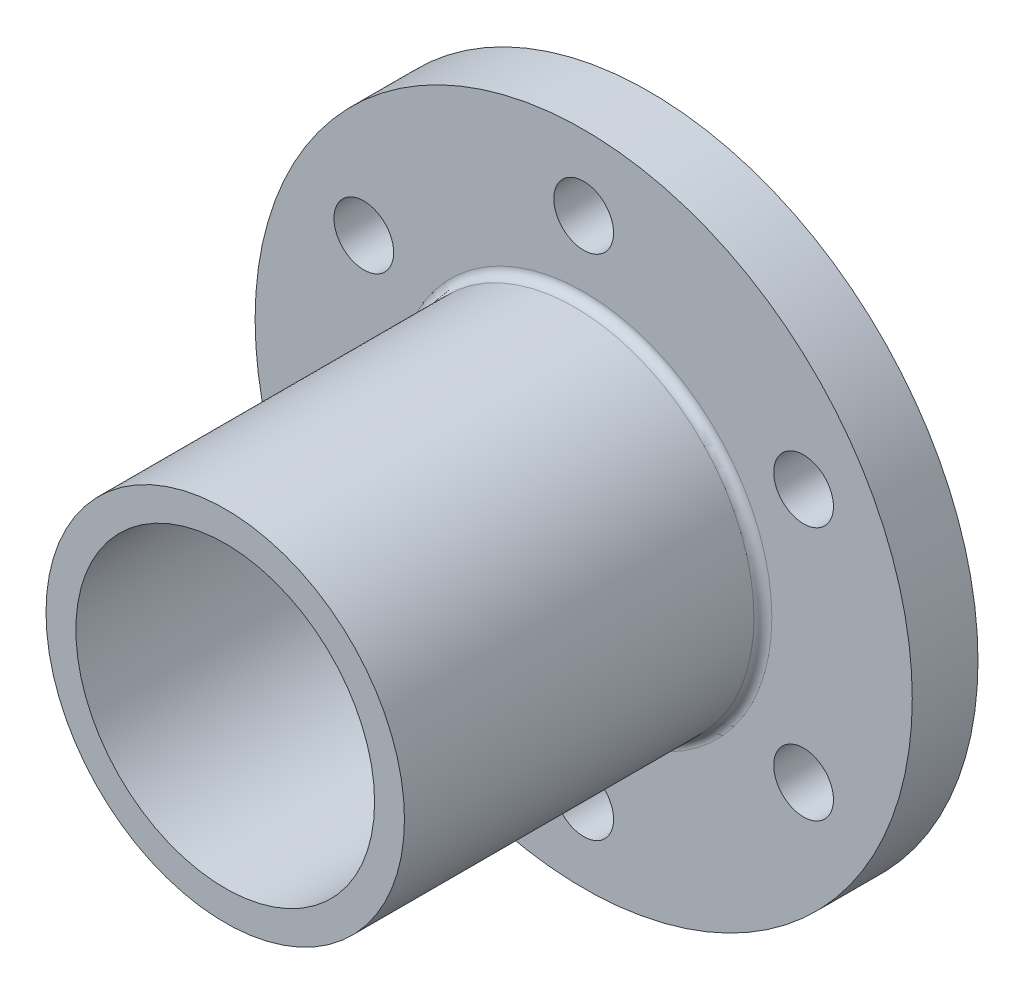
ISO-10303-21;
HEADER;
FILE_DESCRIPTION(('STEP AP214'),'2;1');
FILE_NAME('part.step','',(''),(''),'','','');
FILE_SCHEMA(('AUTOMOTIVE_DESIGN { 1 0 10303 214 1 1 1 1 }'));
ENDSEC;
DATA;
#1=APPLICATION_CONTEXT('core data for automotive mechanical design processes');
#2=APPLICATION_PROTOCOL_DEFINITION('international standard','automotive_design',2000,#1);
#3=PRODUCT_CONTEXT('',#1,'mechanical');
#4=PRODUCT('Part','Part','',(#3));
#5=PRODUCT_RELATED_PRODUCT_CATEGORY('part','',(#4));
#6=PRODUCT_DEFINITION_FORMATION('','',#4);
#7=PRODUCT_DEFINITION_CONTEXT('part definition',#1,'design');
#8=PRODUCT_DEFINITION('design','',#6,#7);
#9=PRODUCT_DEFINITION_SHAPE('','',#8);
#10=(LENGTH_UNIT() NAMED_UNIT(*) SI_UNIT(.MILLI.,.METRE.));
#11=(NAMED_UNIT(*) PLANE_ANGLE_UNIT() SI_UNIT($,.RADIAN.));
#12=(NAMED_UNIT(*) SI_UNIT($,.STERADIAN.) SOLID_ANGLE_UNIT());
#13=UNCERTAINTY_MEASURE_WITH_UNIT(LENGTH_MEASURE(1.E-05),#10,'distance_accuracy_value','');
#14=(GEOMETRIC_REPRESENTATION_CONTEXT(3) GLOBAL_UNCERTAINTY_ASSIGNED_CONTEXT((#13)) GLOBAL_UNIT_ASSIGNED_CONTEXT((#10,
#11,#12)) REPRESENTATION_CONTEXT('',''));
#15=CARTESIAN_POINT('',(0.,0.,0.));
#16=DIRECTION('',(0.,0.,1.));
#17=DIRECTION('',(1.,0.,0.));
#18=AXIS2_PLACEMENT_3D('',#15,#16,#17);
#19=CARTESIAN_POINT('',(0.,0.,22.));
#20=DIRECTION('',(0.,0.,-1.));
#21=DIRECTION('',(-1.,0.,0.));
#22=AXIS2_PLACEMENT_3D('',#19,#20,#21);
#23=CYLINDRICAL_SURFACE('',#22,110.);
#24=CARTESIAN_POINT('',(0.,0.,22.));
#25=DIRECTION('',(0.,0.,1.));
#26=DIRECTION('',(1.,0.,0.));
#27=AXIS2_PLACEMENT_3D('',#24,#25,#26);
#28=CIRCLE('',#27,110.);
#29=CARTESIAN_POINT('',(110.,0.,22.));
#30=VERTEX_POINT('',#29);
#31=EDGE_CURVE('E42',#30,#30,#28,.T.);
#32=ORIENTED_EDGE('',*,*,#31,.F.);
#33=EDGE_LOOP('',(#32));
#34=FACE_BOUND('',#33,.T.);
#35=CARTESIAN_POINT('',(0.,0.,0.));
#36=DIRECTION('',(0.,0.,1.));
#37=DIRECTION('',(1.,0.,0.));
#38=AXIS2_PLACEMENT_3D('',#35,#36,#37);
#39=CIRCLE('',#38,110.);
#40=CARTESIAN_POINT('',(110.,0.,0.));
#41=VERTEX_POINT('',#40);
#42=EDGE_CURVE('E46',#41,#41,#39,.T.);
#43=ORIENTED_EDGE('',*,*,#42,.T.);
#44=EDGE_LOOP('',(#43));
#45=FACE_BOUND('',#44,.T.);
#46=ADVANCED_FACE('F31',(#34,#45),#23,.T.);
#47=CARTESIAN_POINT('',(0.,0.,22.));
#48=DIRECTION('',(0.,0.,1.));
#49=DIRECTION('',(1.,0.,0.));
#50=AXIS2_PLACEMENT_3D('',#47,#48,#49);
#51=PLANE('',#50);
#52=CARTESIAN_POINT('',(0.,0.,22.));
#53=DIRECTION('',(0.,0.,1.));
#54=DIRECTION('',(1.,0.,0.));
#55=AXIS2_PLACEMENT_3D('',#52,#53,#54);
#56=CIRCLE('',#55,63.);
#57=CARTESIAN_POINT('',(63.,0.,22.));
#58=VERTEX_POINT('',#57);
#59=EDGE_CURVE('E10',#58,#58,#56,.F.);
#60=ORIENTED_EDGE('',*,*,#59,.T.);
#61=EDGE_LOOP('',(#60));
#62=FACE_BOUND('',#61,.T.);
#63=CARTESIAN_POINT('',(73.6121593216792,42.5,22.));
#64=DIRECTION('',(0.,0.,1.));
#65=DIRECTION('',(1.,0.,0.));
#66=AXIS2_PLACEMENT_3D('',#63,#64,#65);
#67=CIRCLE('',#66,9.99999999999878);
#68=CARTESIAN_POINT('',(83.6121593216779,42.5,22.));
#69=VERTEX_POINT('',#68);
#70=EDGE_CURVE('E91',#69,#69,#67,.T.);
#71=ORIENTED_EDGE('',*,*,#70,.F.);
#72=EDGE_LOOP('',(#71));
#73=FACE_BOUND('',#72,.T.);
#74=CARTESIAN_POINT('',(73.6121593216773,-42.5,22.));
#75=DIRECTION('',(0.,0.,1.));
#76=DIRECTION('',(1.,0.,0.));
#77=AXIS2_PLACEMENT_3D('',#74,#75,#76);
#78=CIRCLE('',#77,10.0000000000004);
#79=CARTESIAN_POINT('',(83.6121593216777,-42.5,22.));
#80=VERTEX_POINT('',#79);
#81=EDGE_CURVE('E85',#80,#80,#78,.T.);
#82=ORIENTED_EDGE('',*,*,#81,.F.);
#83=EDGE_LOOP('',(#82));
#84=FACE_BOUND('',#83,.T.);
#85=CARTESIAN_POINT('',(0.,-85.,22.));
#86=DIRECTION('',(0.,0.,1.));
#87=DIRECTION('',(1.,0.,0.));
#88=AXIS2_PLACEMENT_3D('',#85,#86,#87);
#89=CIRCLE('',#88,10.0000000000006);
#90=CARTESIAN_POINT('',(10.0000000000006,-85.,22.));
#91=VERTEX_POINT('',#90);
#92=EDGE_CURVE('E79',#91,#91,#89,.T.);
#93=ORIENTED_EDGE('',*,*,#92,.F.);
#94=EDGE_LOOP('',(#93));
#95=FACE_BOUND('',#94,.T.);
#96=CARTESIAN_POINT('',(-73.6121593216773,-42.5,22.));
#97=DIRECTION('',(0.,0.,1.));
#98=DIRECTION('',(1.,0.,0.));
#99=AXIS2_PLACEMENT_3D('',#96,#97,#98);
#100=CIRCLE('',#99,10.0000000000008);
#101=CARTESIAN_POINT('',(-63.6121593216765,-42.5,22.));
#102=VERTEX_POINT('',#101);
#103=EDGE_CURVE('E73',#102,#102,#100,.T.);
#104=ORIENTED_EDGE('',*,*,#103,.F.);
#105=EDGE_LOOP('',(#104));
#106=FACE_BOUND('',#105,.T.);
#107=CARTESIAN_POINT('',(-73.6121593216782,42.4999999999984,22.));
#108=DIRECTION('',(0.,0.,1.));
#109=DIRECTION('',(1.,0.,0.));
#110=AXIS2_PLACEMENT_3D('',#107,#108,#109);
#111=CIRCLE('',#110,10.0000000000027);
#112=CARTESIAN_POINT('',(-63.6121593216755,42.4999999999984,22.));
#113=VERTEX_POINT('',#112);
#114=EDGE_CURVE('E67',#113,#113,#111,.T.);
#115=ORIENTED_EDGE('',*,*,#114,.F.);
#116=EDGE_LOOP('',(#115));
#117=FACE_BOUND('',#116,.T.);
#118=CARTESIAN_POINT('',(0.,85.,22.));
#119=DIRECTION('',(0.,0.,1.));
#120=DIRECTION('',(1.,0.,0.));
#121=AXIS2_PLACEMENT_3D('',#118,#119,#120);
#122=CIRCLE('',#121,10.);
#123=CARTESIAN_POINT('',(10.,85.,22.));
#124=VERTEX_POINT('',#123);
#125=EDGE_CURVE('E61',#124,#124,#122,.T.);
#126=ORIENTED_EDGE('',*,*,#125,.F.);
#127=EDGE_LOOP('',(#126));
#128=FACE_BOUND('',#127,.T.);
#129=ORIENTED_EDGE('',*,*,#31,.T.);
#130=EDGE_LOOP('',(#129));
#131=FACE_BOUND('',#130,.T.);
#132=ADVANCED_FACE('F107',(#62,#73,#84,#95,#106,#117,#128,#131),#51,.T.);
#133=CARTESIAN_POINT('',(0.,0.,0.));
#134=DIRECTION('',(0.,0.,1.));
#135=DIRECTION('',(1.,0.,0.));
#136=AXIS2_PLACEMENT_3D('',#133,#134,#135);
#137=PLANE('',#136);
#138=CARTESIAN_POINT('',(73.6121593216792,42.5,0.));
#139=DIRECTION('',(0.,0.,1.));
#140=DIRECTION('',(1.,0.,0.));
#141=AXIS2_PLACEMENT_3D('',#138,#139,#140);
#142=CIRCLE('',#141,9.99999999999878);
#143=CARTESIAN_POINT('',(83.6121593216779,42.5,0.));
#144=VERTEX_POINT('',#143);
#145=EDGE_CURVE('E64',#144,#144,#142,.T.);
#146=ORIENTED_EDGE('',*,*,#145,.T.);
#147=EDGE_LOOP('',(#146));
#148=FACE_BOUND('',#147,.T.);
#149=CARTESIAN_POINT('',(73.6121593216773,-42.5,0.));
#150=DIRECTION('',(0.,0.,1.));
#151=DIRECTION('',(1.,0.,0.));
#152=AXIS2_PLACEMENT_3D('',#149,#150,#151);
#153=CIRCLE('',#152,10.0000000000004);
#154=CARTESIAN_POINT('',(83.6121593216777,-42.5,0.));
#155=VERTEX_POINT('',#154);
#156=EDGE_CURVE('E88',#155,#155,#153,.T.);
#157=ORIENTED_EDGE('',*,*,#156,.T.);
#158=EDGE_LOOP('',(#157));
#159=FACE_BOUND('',#158,.T.);
#160=CARTESIAN_POINT('',(0.,-85.,0.));
#161=DIRECTION('',(0.,0.,1.));
#162=DIRECTION('',(1.,0.,0.));
#163=AXIS2_PLACEMENT_3D('',#160,#161,#162);
#164=CIRCLE('',#163,10.0000000000006);
#165=CARTESIAN_POINT('',(10.0000000000006,-85.,0.));
#166=VERTEX_POINT('',#165);
#167=EDGE_CURVE('E82',#166,#166,#164,.T.);
#168=ORIENTED_EDGE('',*,*,#167,.T.);
#169=EDGE_LOOP('',(#168));
#170=FACE_BOUND('',#169,.T.);
#171=CARTESIAN_POINT('',(-73.6121593216773,-42.5,0.));
#172=DIRECTION('',(0.,0.,1.));
#173=DIRECTION('',(1.,0.,0.));
#174=AXIS2_PLACEMENT_3D('',#171,#172,#173);
#175=CIRCLE('',#174,10.0000000000008);
#176=CARTESIAN_POINT('',(-63.6121593216765,-42.5,0.));
#177=VERTEX_POINT('',#176);
#178=EDGE_CURVE('E76',#177,#177,#175,.T.);
#179=ORIENTED_EDGE('',*,*,#178,.T.);
#180=EDGE_LOOP('',(#179));
#181=FACE_BOUND('',#180,.T.);
#182=CARTESIAN_POINT('',(-73.6121593216782,42.4999999999984,0.));
#183=DIRECTION('',(0.,0.,1.));
#184=DIRECTION('',(1.,0.,0.));
#185=AXIS2_PLACEMENT_3D('',#182,#183,#184);
#186=CIRCLE('',#185,10.0000000000027);
#187=CARTESIAN_POINT('',(-63.6121593216755,42.4999999999984,0.));
#188=VERTEX_POINT('',#187);
#189=EDGE_CURVE('E70',#188,#188,#186,.T.);
#190=ORIENTED_EDGE('',*,*,#189,.T.);
#191=EDGE_LOOP('',(#190));
#192=FACE_BOUND('',#191,.T.);
#193=CARTESIAN_POINT('',(0.,85.,0.));
#194=DIRECTION('',(0.,0.,1.));
#195=DIRECTION('',(1.,0.,0.));
#196=AXIS2_PLACEMENT_3D('',#193,#194,#195);
#197=CIRCLE('',#196,10.);
#198=CARTESIAN_POINT('',(10.,85.,0.));
#199=VERTEX_POINT('',#198);
#200=EDGE_CURVE('E58',#199,#199,#197,.T.);
#201=ORIENTED_EDGE('',*,*,#200,.T.);
#202=EDGE_LOOP('',(#201));
#203=FACE_BOUND('',#202,.T.);
#204=CARTESIAN_POINT('',(0.,0.,0.));
#205=DIRECTION('',(0.,0.,1.));
#206=DIRECTION('',(1.,0.,0.));
#207=AXIS2_PLACEMENT_3D('',#204,#205,#206);
#208=CIRCLE('',#207,50.);
#209=CARTESIAN_POINT('',(50.,0.,0.));
#210=VERTEX_POINT('',#209);
#211=EDGE_CURVE('E54',#210,#210,#208,.T.);
#212=ORIENTED_EDGE('',*,*,#211,.T.);
#213=EDGE_LOOP('',(#212));
#214=FACE_BOUND('',#213,.T.);
#215=ORIENTED_EDGE('',*,*,#42,.F.);
#216=EDGE_LOOP('',(#215));
#217=FACE_BOUND('',#216,.T.);
#218=ADVANCED_FACE('F97',(#148,#159,#170,#181,#192,#203,#214,#217),#137,.F.);
#219=CARTESIAN_POINT('',(0.,0.,142.));
#220=DIRECTION('',(0.,0.,-1.));
#221=DIRECTION('',(-1.,0.,0.));
#222=AXIS2_PLACEMENT_3D('',#219,#220,#221);
#223=CYLINDRICAL_SURFACE('',#222,60.);
#224=CARTESIAN_POINT('',(0.,0.,25.));
#225=DIRECTION('',(0.,0.,1.));
#226=DIRECTION('',(1.,0.,0.));
#227=AXIS2_PLACEMENT_3D('',#224,#225,#226);
#228=CIRCLE('',#227,60.);
#229=CARTESIAN_POINT('',(60.,0.,25.));
#230=VERTEX_POINT('',#229);
#231=EDGE_CURVE('E38',#230,#230,#228,.T.);
#232=ORIENTED_EDGE('',*,*,#231,.T.);
#233=EDGE_LOOP('',(#232));
#234=FACE_BOUND('',#233,.T.);
#235=CARTESIAN_POINT('',(0.,0.,142.));
#236=DIRECTION('',(0.,0.,1.));
#237=DIRECTION('',(1.,0.,0.));
#238=AXIS2_PLACEMENT_3D('',#235,#236,#237);
#239=CIRCLE('',#238,60.);
#240=CARTESIAN_POINT('',(60.,0.,142.));
#241=VERTEX_POINT('',#240);
#242=EDGE_CURVE('E50',#241,#241,#239,.T.);
#243=ORIENTED_EDGE('',*,*,#242,.F.);
#244=EDGE_LOOP('',(#243));
#245=FACE_BOUND('',#244,.T.);
#246=ADVANCED_FACE('F128',(#234,#245),#223,.T.);
#247=CARTESIAN_POINT('',(0.,0.,142.));
#248=DIRECTION('',(0.,0.,1.));
#249=DIRECTION('',(1.,0.,0.));
#250=AXIS2_PLACEMENT_3D('',#247,#248,#249);
#251=PLANE('',#250);
#252=CARTESIAN_POINT('',(0.,0.,142.));
#253=DIRECTION('',(0.,0.,1.));
#254=DIRECTION('',(1.,0.,0.));
#255=AXIS2_PLACEMENT_3D('',#252,#253,#254);
#256=CIRCLE('',#255,50.);
#257=CARTESIAN_POINT('',(50.,0.,142.));
#258=VERTEX_POINT('',#257);
#259=EDGE_CURVE('E55',#258,#258,#256,.T.);
#260=ORIENTED_EDGE('',*,*,#259,.F.);
#261=EDGE_LOOP('',(#260));
#262=FACE_BOUND('',#261,.T.);
#263=ORIENTED_EDGE('',*,*,#242,.T.);
#264=EDGE_LOOP('',(#263));
#265=FACE_BOUND('',#264,.T.);
#266=ADVANCED_FACE('F133',(#262,#265),#251,.T.);
#267=CARTESIAN_POINT('',(0.,0.,0.));
#268=DIRECTION('',(0.,0.,1.));
#269=DIRECTION('',(1.,0.,0.));
#270=AXIS2_PLACEMENT_3D('',#267,#268,#269);
#271=CYLINDRICAL_SURFACE('',#270,50.);
#272=ORIENTED_EDGE('',*,*,#211,.F.);
#273=EDGE_LOOP('',(#272));
#274=FACE_BOUND('',#273,.T.);
#275=ORIENTED_EDGE('',*,*,#259,.T.);
#276=EDGE_LOOP('',(#275));
#277=FACE_BOUND('',#276,.T.);
#278=ADVANCED_FACE('F138',(#274,#277),#271,.F.);
#279=CARTESIAN_POINT('',(0.,85.,0.));
#280=DIRECTION('',(0.,0.,1.));
#281=DIRECTION('',(1.,0.,0.));
#282=AXIS2_PLACEMENT_3D('',#279,#280,#281);
#283=CYLINDRICAL_SURFACE('',#282,10.);
#284=ORIENTED_EDGE('',*,*,#200,.F.);
#285=EDGE_LOOP('',(#284));
#286=FACE_BOUND('',#285,.T.);
#287=ORIENTED_EDGE('',*,*,#125,.T.);
#288=EDGE_LOOP('',(#287));
#289=FACE_BOUND('',#288,.T.);
#290=ADVANCED_FACE('F142',(#286,#289),#283,.F.);
#291=CARTESIAN_POINT('',(-73.6121593216782,42.4999999999984,0.));
#292=DIRECTION('',(0.,0.,1.));
#293=DIRECTION('',(1.,0.,0.));
#294=AXIS2_PLACEMENT_3D('',#291,#292,#293);
#295=CYLINDRICAL_SURFACE('',#294,10.0000000000027);
#296=ORIENTED_EDGE('',*,*,#189,.F.);
#297=EDGE_LOOP('',(#296));
#298=FACE_BOUND('',#297,.T.);
#299=ORIENTED_EDGE('',*,*,#114,.T.);
#300=EDGE_LOOP('',(#299));
#301=FACE_BOUND('',#300,.T.);
#302=ADVANCED_FACE('F146',(#298,#301),#295,.F.);
#303=CARTESIAN_POINT('',(-73.6121593216773,-42.5,0.));
#304=DIRECTION('',(0.,0.,1.));
#305=DIRECTION('',(1.,0.,0.));
#306=AXIS2_PLACEMENT_3D('',#303,#304,#305);
#307=CYLINDRICAL_SURFACE('',#306,10.0000000000008);
#308=ORIENTED_EDGE('',*,*,#178,.F.);
#309=EDGE_LOOP('',(#308));
#310=FACE_BOUND('',#309,.T.);
#311=ORIENTED_EDGE('',*,*,#103,.T.);
#312=EDGE_LOOP('',(#311));
#313=FACE_BOUND('',#312,.T.);
#314=ADVANCED_FACE('F150',(#310,#313),#307,.F.);
#315=CARTESIAN_POINT('',(0.,-85.,0.));
#316=DIRECTION('',(0.,0.,1.));
#317=DIRECTION('',(1.,0.,0.));
#318=AXIS2_PLACEMENT_3D('',#315,#316,#317);
#319=CYLINDRICAL_SURFACE('',#318,10.0000000000006);
#320=ORIENTED_EDGE('',*,*,#167,.F.);
#321=EDGE_LOOP('',(#320));
#322=FACE_BOUND('',#321,.T.);
#323=ORIENTED_EDGE('',*,*,#92,.T.);
#324=EDGE_LOOP('',(#323));
#325=FACE_BOUND('',#324,.T.);
#326=ADVANCED_FACE('F154',(#322,#325),#319,.F.);
#327=CARTESIAN_POINT('',(73.6121593216773,-42.5,0.));
#328=DIRECTION('',(0.,0.,1.));
#329=DIRECTION('',(1.,0.,0.));
#330=AXIS2_PLACEMENT_3D('',#327,#328,#329);
#331=CYLINDRICAL_SURFACE('',#330,10.0000000000004);
#332=ORIENTED_EDGE('',*,*,#156,.F.);
#333=EDGE_LOOP('',(#332));
#334=FACE_BOUND('',#333,.T.);
#335=ORIENTED_EDGE('',*,*,#81,.T.);
#336=EDGE_LOOP('',(#335));
#337=FACE_BOUND('',#336,.T.);
#338=ADVANCED_FACE('F103',(#334,#337),#331,.F.);
#339=CARTESIAN_POINT('',(73.6121593216792,42.5,0.));
#340=DIRECTION('',(0.,0.,1.));
#341=DIRECTION('',(1.,0.,0.));
#342=AXIS2_PLACEMENT_3D('',#339,#340,#341);
#343=CYLINDRICAL_SURFACE('',#342,9.99999999999878);
#344=ORIENTED_EDGE('',*,*,#145,.F.);
#345=EDGE_LOOP('',(#344));
#346=FACE_BOUND('',#345,.T.);
#347=ORIENTED_EDGE('',*,*,#70,.T.);
#348=EDGE_LOOP('',(#347));
#349=FACE_BOUND('',#348,.T.);
#350=ADVANCED_FACE('F100',(#346,#349),#343,.F.);
#351=CARTESIAN_POINT('',(0.,0.,25.));
#352=DIRECTION('',(0.,0.,1.));
#353=DIRECTION('',(1.,0.,0.));
#354=AXIS2_PLACEMENT_3D('',#351,#352,#353);
#355=TOROIDAL_SURFACE('',#354,63.,3.);
#356=ORIENTED_EDGE('',*,*,#59,.F.);
#357=EDGE_LOOP('',(#356));
#358=FACE_BOUND('',#357,.T.);
#359=ORIENTED_EDGE('',*,*,#231,.F.);
#360=EDGE_LOOP('',(#359));
#361=FACE_BOUND('',#360,.T.);
#362=ADVANCED_FACE('F33',(#358,#361),#355,.F.);
#363=CLOSED_SHELL('',(#46,#132,#218,#246,#266,#278,#290,#302,#314,#326,#338,#350,#362));
#364=MANIFOLD_SOLID_BREP('B2',#363);
#365=ADVANCED_BREP_SHAPE_REPRESENTATION('',(#18,#364),#14);
#366=SHAPE_DEFINITION_REPRESENTATION(#9,#365);
ENDSEC;
END-ISO-10303-21;
